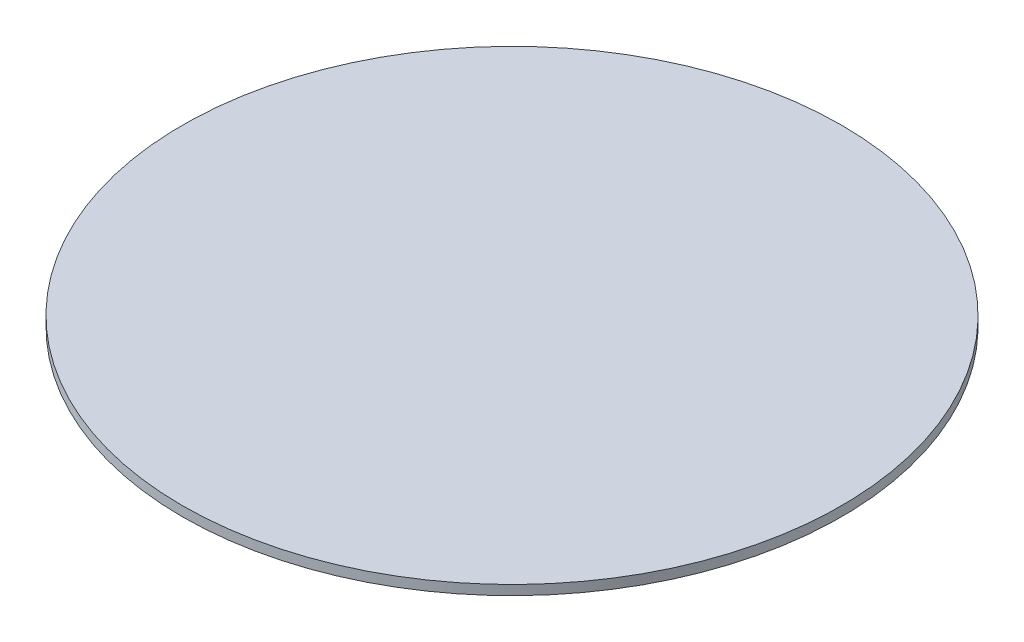
ISO-10303-21;
HEADER;
FILE_DESCRIPTION(('STEP AP214'),'2;1');
FILE_NAME('part.step','',(''),(''),'','','');
FILE_SCHEMA(('AUTOMOTIVE_DESIGN { 1 0 10303 214 1 1 1 1 }'));
ENDSEC;
DATA;
#1=APPLICATION_CONTEXT('core data for automotive mechanical design processes');
#2=APPLICATION_PROTOCOL_DEFINITION('international standard','automotive_design',2000,#1);
#3=PRODUCT_CONTEXT('',#1,'mechanical');
#4=PRODUCT('Part','Part','',(#3));
#5=PRODUCT_RELATED_PRODUCT_CATEGORY('part','',(#4));
#6=PRODUCT_DEFINITION_FORMATION('','',#4);
#7=PRODUCT_DEFINITION_CONTEXT('part definition',#1,'design');
#8=PRODUCT_DEFINITION('design','',#6,#7);
#9=PRODUCT_DEFINITION_SHAPE('','',#8);
#10=(LENGTH_UNIT() NAMED_UNIT(*) SI_UNIT(.MILLI.,.METRE.));
#11=(NAMED_UNIT(*) PLANE_ANGLE_UNIT() SI_UNIT($,.RADIAN.));
#12=(NAMED_UNIT(*) SI_UNIT($,.STERADIAN.) SOLID_ANGLE_UNIT());
#13=UNCERTAINTY_MEASURE_WITH_UNIT(LENGTH_MEASURE(1.E-05),#10,'distance_accuracy_value','');
#14=(GEOMETRIC_REPRESENTATION_CONTEXT(3) GLOBAL_UNCERTAINTY_ASSIGNED_CONTEXT((#13)) GLOBAL_UNIT_ASSIGNED_CONTEXT((#10,
#11,#12)) REPRESENTATION_CONTEXT('',''));
#15=CARTESIAN_POINT('',(0.,0.,0.));
#16=DIRECTION('',(0.,0.,1.));
#17=DIRECTION('',(1.,0.,0.));
#18=AXIS2_PLACEMENT_3D('',#15,#16,#17);
#19=CARTESIAN_POINT('',(0.,0.560547,0.));
#20=DIRECTION('',(0.,-1.,0.));
#21=DIRECTION('',(0.,0.,-1.));
#22=AXIS2_PLACEMENT_3D('',#19,#20,#21);
#23=CYLINDRICAL_SURFACE('',#22,19.1);
#24=CARTESIAN_POINT('',(0.,0.560547,0.));
#25=DIRECTION('',(0.,1.,0.));
#26=DIRECTION('',(0.,0.,1.));
#27=AXIS2_PLACEMENT_3D('',#24,#25,#26);
#28=CIRCLE('',#27,19.1);
#29=CARTESIAN_POINT('',(0.,0.560547,19.1));
#30=VERTEX_POINT('',#29);
#31=EDGE_CURVE('E10',#30,#30,#28,.T.);
#32=ORIENTED_EDGE('',*,*,#31,.F.);
#33=EDGE_LOOP('',(#32));
#34=FACE_BOUND('',#33,.T.);
#35=CARTESIAN_POINT('',(0.,0.,0.));
#36=DIRECTION('',(0.,1.,0.));
#37=DIRECTION('',(0.,0.,1.));
#38=AXIS2_PLACEMENT_3D('',#35,#36,#37);
#39=CIRCLE('',#38,19.1);
#40=CARTESIAN_POINT('',(0.,0.,19.1));
#41=VERTEX_POINT('',#40);
#42=EDGE_CURVE('E40',#41,#41,#39,.T.);
#43=ORIENTED_EDGE('',*,*,#42,.T.);
#44=EDGE_LOOP('',(#43));
#45=FACE_BOUND('',#44,.T.);
#46=ADVANCED_FACE('F37',(#34,#45),#23,.T.);
#47=CARTESIAN_POINT('',(0.,0.560547,0.));
#48=DIRECTION('',(0.,1.,0.));
#49=DIRECTION('',(0.,0.,1.));
#50=AXIS2_PLACEMENT_3D('',#47,#48,#49);
#51=PLANE('',#50);
#52=ORIENTED_EDGE('',*,*,#31,.T.);
#53=EDGE_LOOP('',(#52));
#54=FACE_BOUND('',#53,.T.);
#55=ADVANCED_FACE('F54',(#54),#51,.T.);
#56=CARTESIAN_POINT('',(0.,0.,0.));
#57=DIRECTION('',(0.,1.,0.));
#58=DIRECTION('',(0.,0.,1.));
#59=AXIS2_PLACEMENT_3D('',#56,#57,#58);
#60=PLANE('',#59);
#61=ORIENTED_EDGE('',*,*,#42,.F.);
#62=EDGE_LOOP('',(#61));
#63=FACE_BOUND('',#62,.T.);
#64=ADVANCED_FACE('F52',(#63),#60,.F.);
#65=CLOSED_SHELL('',(#46,#55,#64));
#66=MANIFOLD_SOLID_BREP('B2',#65);
#67=ADVANCED_BREP_SHAPE_REPRESENTATION('',(#18,#66),#14);
#68=SHAPE_DEFINITION_REPRESENTATION(#9,#67);
ENDSEC;
END-ISO-10303-21;
